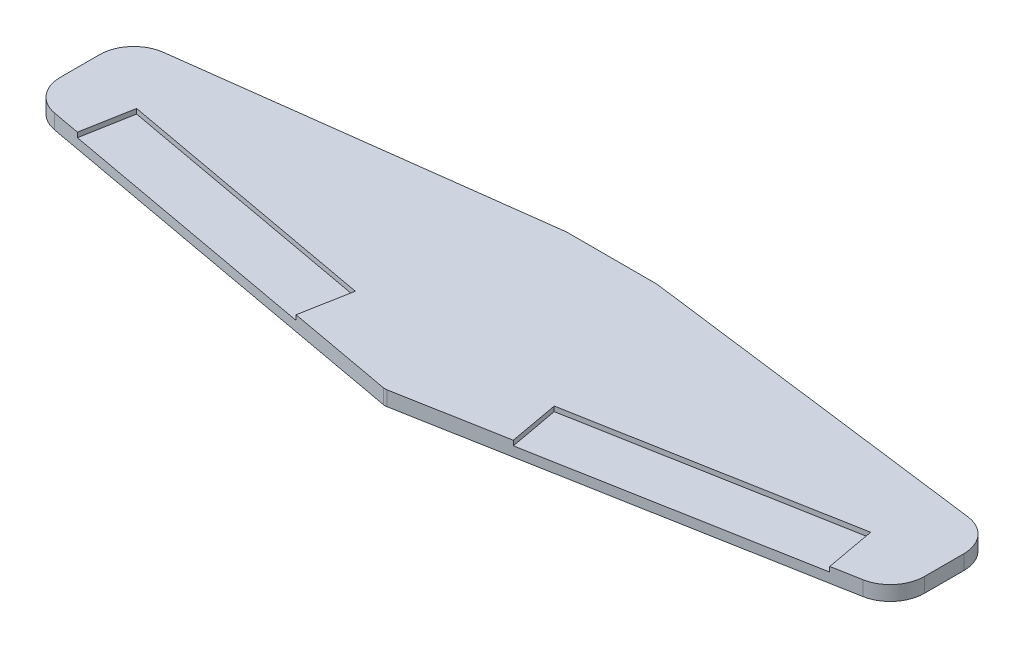
ISO-10303-21;
HEADER;
FILE_DESCRIPTION(('STEP AP214'),'2;1');
FILE_NAME('part.step','',(''),(''),'','','');
FILE_SCHEMA(('AUTOMOTIVE_DESIGN { 1 0 10303 214 1 1 1 1 }'));
ENDSEC;
DATA;
#1=APPLICATION_CONTEXT('core data for automotive mechanical design processes');
#2=APPLICATION_PROTOCOL_DEFINITION('international standard','automotive_design',2000,#1);
#3=PRODUCT_CONTEXT('',#1,'mechanical');
#4=PRODUCT('Part','Part','',(#3));
#5=PRODUCT_RELATED_PRODUCT_CATEGORY('part','',(#4));
#6=PRODUCT_DEFINITION_FORMATION('','',#4);
#7=PRODUCT_DEFINITION_CONTEXT('part definition',#1,'design');
#8=PRODUCT_DEFINITION('design','',#6,#7);
#9=PRODUCT_DEFINITION_SHAPE('','',#8);
#10=(LENGTH_UNIT() NAMED_UNIT(*) SI_UNIT(.MILLI.,.METRE.));
#11=(NAMED_UNIT(*) PLANE_ANGLE_UNIT() SI_UNIT($,.RADIAN.));
#12=(NAMED_UNIT(*) SI_UNIT($,.STERADIAN.) SOLID_ANGLE_UNIT());
#13=UNCERTAINTY_MEASURE_WITH_UNIT(LENGTH_MEASURE(1.E-05),#10,'distance_accuracy_value','');
#14=(GEOMETRIC_REPRESENTATION_CONTEXT(3) GLOBAL_UNCERTAINTY_ASSIGNED_CONTEXT((#13)) GLOBAL_UNIT_ASSIGNED_CONTEXT((#10,
#11,#12)) REPRESENTATION_CONTEXT('',''));
#15=CARTESIAN_POINT('',(0.,0.,0.));
#16=DIRECTION('',(0.,0.,1.));
#17=DIRECTION('',(1.,0.,0.));
#18=AXIS2_PLACEMENT_3D('',#15,#16,#17);
#19=CARTESIAN_POINT('',(-9.26124305778792,3.,-19.1353726476667));
#20=DIRECTION('',(0.127743051926493,0.,0.991807296144017));
#21=DIRECTION('',(0.991807296144017,0.,-0.127743051926493));
#22=AXIS2_PLACEMENT_3D('',#19,#20,#21);
#23=PLANE('',#22);
#24=DIRECTION('',(-0.991807296144017,0.,0.127743051926493));
#25=VECTOR('',#24,1.);
#26=CARTESIAN_POINT('',(-9.26124305778792,0.,-19.1353726476667));
#27=LINE('',#26,#25);
#28=CARTESIAN_POINT('',(-9.26124305778792,0.,-19.1353726476667));
#29=VERTEX_POINT('',#28);
#30=CARTESIAN_POINT('',(-82.3942013634854,0.,-9.71597502203537));
#31=VERTEX_POINT('',#30);
#32=EDGE_CURVE('E257',#29,#31,#27,.T.);
#33=ORIENTED_EDGE('',*,*,#32,.T.);
#34=DIRECTION('',(0.,-1.,0.));
#35=VECTOR('',#34,1.);
#36=CARTESIAN_POINT('',(-82.3942013634854,3.,-9.71597502203537));
#37=LINE('',#36,#35);
#38=CARTESIAN_POINT('',(-82.3942013634854,3.,-9.71597502203537));
#39=VERTEX_POINT('',#38);
#40=EDGE_CURVE('E307',#39,#31,#37,.T.);
#41=ORIENTED_EDGE('',*,*,#40,.F.);
#42=DIRECTION('',(-0.991807296144017,0.,0.127743051926493));
#43=VECTOR('',#42,1.);
#44=CARTESIAN_POINT('',(-9.26124305778792,3.,-19.1353726476667));
#45=LINE('',#44,#43);
#46=CARTESIAN_POINT('',(-9.26124305778792,3.,-19.1353726476667));
#47=VERTEX_POINT('',#46);
#48=EDGE_CURVE('E229',#47,#39,#45,.T.);
#49=ORIENTED_EDGE('',*,*,#48,.F.);
#50=DIRECTION('',(0.,-1.,0.));
#51=VECTOR('',#50,1.);
#52=CARTESIAN_POINT('',(-9.26124305778792,3.,-19.1353726476667));
#53=LINE('',#52,#51);
#54=EDGE_CURVE('E256',#47,#29,#53,.T.);
#55=ORIENTED_EDGE('',*,*,#54,.T.);
#56=EDGE_LOOP('',(#33,#41,#49,#55));
#57=FACE_BOUND('',#56,.T.);
#58=ADVANCED_FACE('F38',(#57),#23,.F.);
#59=CARTESIAN_POINT('',(-81.5,3.,-2.77332394902725));
#60=DIRECTION('',(0.,-1.,0.));
#61=DIRECTION('',(0.,0.,-1.));
#62=AXIS2_PLACEMENT_3D('',#59,#60,#61);
#63=CYLINDRICAL_SURFACE('',#62,7.);
#64=CARTESIAN_POINT('',(-81.5,0.,-2.77332394902725));
#65=DIRECTION('',(0.,1.,0.));
#66=DIRECTION('',(0.,0.,1.));
#67=AXIS2_PLACEMENT_3D('',#64,#65,#66);
#68=CIRCLE('',#67,7.);
#69=CARTESIAN_POINT('',(-88.5,0.,-2.7733239490272));
#70=VERTEX_POINT('',#69);
#71=EDGE_CURVE('E260',#31,#70,#68,.T.);
#72=ORIENTED_EDGE('',*,*,#71,.T.);
#73=DIRECTION('',(0.,-1.,0.));
#74=VECTOR('',#73,1.);
#75=CARTESIAN_POINT('',(-88.5,3.,-2.7733239490272));
#76=LINE('',#75,#74);
#77=CARTESIAN_POINT('',(-88.5,3.,-2.7733239490272));
#78=VERTEX_POINT('',#77);
#79=EDGE_CURVE('E304',#78,#70,#76,.T.);
#80=ORIENTED_EDGE('',*,*,#79,.F.);
#81=CARTESIAN_POINT('',(-81.5,3.,-2.77332394902725));
#82=DIRECTION('',(0.,1.,0.));
#83=DIRECTION('',(0.,0.,1.));
#84=AXIS2_PLACEMENT_3D('',#81,#82,#83);
#85=CIRCLE('',#84,7.);
#86=EDGE_CURVE('E232',#39,#78,#85,.T.);
#87=ORIENTED_EDGE('',*,*,#86,.F.);
#88=ORIENTED_EDGE('',*,*,#40,.T.);
#89=EDGE_LOOP('',(#72,#80,#87,#88));
#90=FACE_BOUND('',#89,.T.);
#91=ADVANCED_FACE('F371',(#90),#63,.T.);
#92=CARTESIAN_POINT('',(-88.5,3.,-2.7733239490272));
#93=DIRECTION('',(1.,0.,0.));
#94=DIRECTION('',(0.,0.,-1.));
#95=AXIS2_PLACEMENT_3D('',#92,#93,#94);
#96=PLANE('',#95);
#97=DIRECTION('',(0.,0.,1.));
#98=VECTOR('',#97,1.);
#99=CARTESIAN_POINT('',(-88.5,0.,-2.7733239490272));
#100=LINE('',#99,#98);
#101=CARTESIAN_POINT('',(-88.5,0.,5.30107192058601));
#102=VERTEX_POINT('',#101);
#103=EDGE_CURVE('E263',#70,#102,#100,.T.);
#104=ORIENTED_EDGE('',*,*,#103,.T.);
#105=DIRECTION('',(0.,-1.,0.));
#106=VECTOR('',#105,1.);
#107=CARTESIAN_POINT('',(-88.5,3.,5.30107192058601));
#108=LINE('',#107,#106);
#109=CARTESIAN_POINT('',(-88.5,3.,5.30107192058601));
#110=VERTEX_POINT('',#109);
#111=EDGE_CURVE('E301',#110,#102,#108,.T.);
#112=ORIENTED_EDGE('',*,*,#111,.F.);
#113=DIRECTION('',(0.,0.,1.));
#114=VECTOR('',#113,1.);
#115=CARTESIAN_POINT('',(-88.5,3.,-2.7733239490272));
#116=LINE('',#115,#114);
#117=EDGE_CURVE('E235',#78,#110,#116,.T.);
#118=ORIENTED_EDGE('',*,*,#117,.F.);
#119=ORIENTED_EDGE('',*,*,#79,.T.);
#120=EDGE_LOOP('',(#104,#112,#118,#119));
#121=FACE_BOUND('',#120,.T.);
#122=ADVANCED_FACE('F378',(#121),#96,.F.);
#123=CARTESIAN_POINT('',(-81.5,3.,5.30107192058606));
#124=DIRECTION('',(0.,-1.,0.));
#125=DIRECTION('',(0.,0.,-1.));
#126=AXIS2_PLACEMENT_3D('',#123,#124,#125);
#127=CYLINDRICAL_SURFACE('',#126,7.);
#128=CARTESIAN_POINT('',(-81.5,0.,5.30107192058606));
#129=DIRECTION('',(0.,1.,0.));
#130=DIRECTION('',(0.,0.,1.));
#131=AXIS2_PLACEMENT_3D('',#128,#129,#130);
#132=CIRCLE('',#131,7.);
#133=CARTESIAN_POINT('',(-82.758061306265,0.,12.1870926691519));
#134=VERTEX_POINT('',#133);
#135=EDGE_CURVE('E265',#102,#134,#132,.T.);
#136=ORIENTED_EDGE('',*,*,#135,.T.);
#137=DIRECTION('',(0.,-1.,0.));
#138=VECTOR('',#137,1.);
#139=CARTESIAN_POINT('',(-82.758061306265,3.,12.1870926691519));
#140=LINE('',#139,#138);
#141=CARTESIAN_POINT('',(-82.758061306265,3.,12.1870926691519));
#142=VERTEX_POINT('',#141);
#143=EDGE_CURVE('E298',#142,#134,#140,.T.);
#144=ORIENTED_EDGE('',*,*,#143,.F.);
#145=CARTESIAN_POINT('',(-81.5,3.,5.30107192058606));
#146=DIRECTION('',(0.,1.,0.));
#147=DIRECTION('',(0.,0.,1.));
#148=AXIS2_PLACEMENT_3D('',#145,#146,#147);
#149=CIRCLE('',#148,7.);
#150=EDGE_CURVE('E237',#110,#142,#149,.T.);
#151=ORIENTED_EDGE('',*,*,#150,.F.);
#152=ORIENTED_EDGE('',*,*,#111,.T.);
#153=EDGE_LOOP('',(#136,#144,#151,#152));
#154=FACE_BOUND('',#153,.T.);
#155=ADVANCED_FACE('F382',(#154),#127,.T.);
#156=CARTESIAN_POINT('',(-82.758061306265,3.,12.1870926691519));
#157=DIRECTION('',(0.179723043752157,0.,-0.983717249795113));
#158=DIRECTION('',(-0.983717249795113,0.,-0.179723043752157));
#159=AXIS2_PLACEMENT_3D('',#156,#157,#158);
#160=PLANE('',#159);
#161=DIRECTION('',(0.983717249795113,0.,0.179723043752157));
#162=VECTOR('',#161,1.);
#163=CARTESIAN_POINT('',(-22.2418353088571,2.,23.2432781075111));
#164=LINE('',#163,#162);
#165=CARTESIAN_POINT('',(-77.0318534493877,2.,13.2332586334163));
#166=VERTEX_POINT('',#165);
#167=CARTESIAN_POINT('',(-22.2418353088571,2.,23.2432781075111));
#168=VERTEX_POINT('',#167);
#169=EDGE_CURVE('E181',#166,#168,#164,.T.);
#170=ORIENTED_EDGE('',*,*,#169,.F.);
#171=DIRECTION('',(0.,1.,0.));
#172=VECTOR('',#171,1.);
#173=CARTESIAN_POINT('',(-77.0318534493877,2.,13.2332586334163));
#174=LINE('',#173,#172);
#175=CARTESIAN_POINT('',(-77.0318534493877,3.,13.2332586334163));
#176=VERTEX_POINT('',#175);
#177=EDGE_CURVE('E261',#166,#176,#174,.T.);
#178=ORIENTED_EDGE('',*,*,#177,.T.);
#179=DIRECTION('',(0.983717249795113,0.,0.179723043752157));
#180=VECTOR('',#179,1.);
#181=CARTESIAN_POINT('',(-82.758061306265,3.,12.1870926691519));
#182=LINE('',#181,#180);
#183=EDGE_CURVE('E239',#142,#176,#182,.T.);
#184=ORIENTED_EDGE('',*,*,#183,.F.);
#185=ORIENTED_EDGE('',*,*,#143,.T.);
#186=DIRECTION('',(0.983717249795113,0.,0.179723043752157));
#187=VECTOR('',#186,1.);
#188=CARTESIAN_POINT('',(-82.758061306265,0.,12.1870926691519));
#189=LINE('',#188,#187);
#190=CARTESIAN_POINT('',(-0.359446087504323,0.,27.241143953871));
#191=VERTEX_POINT('',#190);
#192=EDGE_CURVE('E267',#134,#191,#189,.T.);
#193=ORIENTED_EDGE('',*,*,#192,.T.);
#194=DIRECTION('',(0.,-1.,0.));
#195=VECTOR('',#194,1.);
#196=CARTESIAN_POINT('',(-0.359446087504323,3.,27.241143953871));
#197=LINE('',#196,#195);
#198=CARTESIAN_POINT('',(-0.359446087504323,3.,27.241143953871));
#199=VERTEX_POINT('',#198);
#200=EDGE_CURVE('E46',#191,#199,#197,.F.);
#201=ORIENTED_EDGE('',*,*,#200,.T.);
#202=CARTESIAN_POINT('',(-22.2418353088571,3.,23.2432781075111));
#203=VERTEX_POINT('',#202);
#204=EDGE_CURVE('E195',#203,#199,#182,.T.);
#205=ORIENTED_EDGE('',*,*,#204,.F.);
#206=DIRECTION('',(0.,1.,0.));
#207=VECTOR('',#206,1.);
#208=CARTESIAN_POINT('',(-22.2418353088571,2.,23.2432781075111));
#209=LINE('',#208,#207);
#210=EDGE_CURVE('E61',#168,#203,#209,.T.);
#211=ORIENTED_EDGE('',*,*,#210,.F.);
#212=EDGE_LOOP('',(#170,#178,#184,#185,#193,#201,#205,#211));
#213=FACE_BOUND('',#212,.T.);
#214=ADVANCED_FACE('F193',(#213),#160,.F.);
#215=CARTESIAN_POINT('',(82.758061306265,3.,12.1870926691519));
#216=DIRECTION('',(-0.179723043752157,0.,-0.983717249795113));
#217=DIRECTION('',(-0.983717249795113,0.,0.179723043752157));
#218=AXIS2_PLACEMENT_3D('',#215,#216,#217);
#219=PLANE('',#218);
#220=DIRECTION('',(0.983717249795113,0.,-0.179723043752157));
#221=VECTOR('',#220,1.);
#222=CARTESIAN_POINT('',(82.758061306265,3.,12.1870926691519));
#223=LINE('',#222,#221);
#224=CARTESIAN_POINT('',(77.0318534493877,3.,13.2332586334163));
#225=VERTEX_POINT('',#224);
#226=CARTESIAN_POINT('',(82.758061306265,3.,12.1870926691519));
#227=VERTEX_POINT('',#226);
#228=EDGE_CURVE('E242',#225,#227,#223,.T.);
#229=ORIENTED_EDGE('',*,*,#228,.F.);
#230=DIRECTION('',(0.,1.,0.));
#231=VECTOR('',#230,1.);
#232=CARTESIAN_POINT('',(77.0318534493877,2.,13.2332586334163));
#233=LINE('',#232,#231);
#234=CARTESIAN_POINT('',(77.0318534493877,2.,13.2332586334163));
#235=VERTEX_POINT('',#234);
#236=EDGE_CURVE('E208',#235,#225,#233,.T.);
#237=ORIENTED_EDGE('',*,*,#236,.F.);
#238=DIRECTION('',(0.983717249795113,0.,-0.179723043752157));
#239=VECTOR('',#238,1.);
#240=CARTESIAN_POINT('',(22.2418353088571,2.,23.2432781075111));
#241=LINE('',#240,#239);
#242=CARTESIAN_POINT('',(22.2418353088571,2.,23.2432781075111));
#243=VERTEX_POINT('',#242);
#244=EDGE_CURVE('E222',#243,#235,#241,.T.);
#245=ORIENTED_EDGE('',*,*,#244,.F.);
#246=DIRECTION('',(0.,1.,0.));
#247=VECTOR('',#246,1.);
#248=CARTESIAN_POINT('',(22.2418353088571,2.,23.2432781075111));
#249=LINE('',#248,#247);
#250=CARTESIAN_POINT('',(22.2418353088571,3.,23.2432781075111));
#251=VERTEX_POINT('',#250);
#252=EDGE_CURVE('E205',#243,#251,#249,.T.);
#253=ORIENTED_EDGE('',*,*,#252,.T.);
#254=CARTESIAN_POINT('',(0.359446087504323,3.,27.241143953871));
#255=VERTEX_POINT('',#254);
#256=EDGE_CURVE('E243',#255,#251,#223,.T.);
#257=ORIENTED_EDGE('',*,*,#256,.F.);
#258=DIRECTION('',(0.,-1.,0.));
#259=VECTOR('',#258,1.);
#260=CARTESIAN_POINT('',(0.359446087504323,3.,27.241143953871));
#261=LINE('',#260,#259);
#262=CARTESIAN_POINT('',(0.359446087504323,0.,27.241143953871));
#263=VERTEX_POINT('',#262);
#264=EDGE_CURVE('E310',#255,#263,#261,.T.);
#265=ORIENTED_EDGE('',*,*,#264,.T.);
#266=DIRECTION('',(0.983717249795113,0.,-0.179723043752157));
#267=VECTOR('',#266,1.);
#268=CARTESIAN_POINT('',(82.758061306265,0.,12.1870926691519));
#269=LINE('',#268,#267);
#270=CARTESIAN_POINT('',(82.758061306265,0.,12.1870926691519));
#271=VERTEX_POINT('',#270);
#272=EDGE_CURVE('E270',#263,#271,#269,.T.);
#273=ORIENTED_EDGE('',*,*,#272,.T.);
#274=DIRECTION('',(0.,-1.,0.));
#275=VECTOR('',#274,1.);
#276=CARTESIAN_POINT('',(82.758061306265,3.,12.1870926691519));
#277=LINE('',#276,#275);
#278=EDGE_CURVE('E295',#227,#271,#277,.T.);
#279=ORIENTED_EDGE('',*,*,#278,.F.);
#280=EDGE_LOOP('',(#229,#237,#245,#253,#257,#265,#273,#279));
#281=FACE_BOUND('',#280,.T.);
#282=ADVANCED_FACE('F326',(#281),#219,.F.);
#283=CARTESIAN_POINT('',(81.5,3.,5.30107192058606));
#284=DIRECTION('',(0.,-1.,0.));
#285=DIRECTION('',(0.,0.,-1.));
#286=AXIS2_PLACEMENT_3D('',#283,#284,#285);
#287=CYLINDRICAL_SURFACE('',#286,7.);
#288=CARTESIAN_POINT('',(81.5,0.,5.30107192058606));
#289=DIRECTION('',(0.,1.,0.));
#290=DIRECTION('',(0.,0.,-1.));
#291=AXIS2_PLACEMENT_3D('',#288,#289,#290);
#292=CIRCLE('',#291,7.);
#293=CARTESIAN_POINT('',(88.5,0.,5.30107192058602));
#294=VERTEX_POINT('',#293);
#295=EDGE_CURVE('E272',#271,#294,#292,.T.);
#296=ORIENTED_EDGE('',*,*,#295,.T.);
#297=DIRECTION('',(0.,-1.,0.));
#298=VECTOR('',#297,1.);
#299=CARTESIAN_POINT('',(88.5,3.,5.30107192058602));
#300=LINE('',#299,#298);
#301=CARTESIAN_POINT('',(88.5,3.,5.30107192058602));
#302=VERTEX_POINT('',#301);
#303=EDGE_CURVE('E292',#302,#294,#300,.T.);
#304=ORIENTED_EDGE('',*,*,#303,.F.);
#305=CARTESIAN_POINT('',(81.5,3.,5.30107192058606));
#306=DIRECTION('',(0.,1.,0.));
#307=DIRECTION('',(0.,0.,-1.));
#308=AXIS2_PLACEMENT_3D('',#305,#306,#307);
#309=CIRCLE('',#308,7.);
#310=EDGE_CURVE('E246',#227,#302,#309,.T.);
#311=ORIENTED_EDGE('',*,*,#310,.F.);
#312=ORIENTED_EDGE('',*,*,#278,.T.);
#313=EDGE_LOOP('',(#296,#304,#311,#312));
#314=FACE_BOUND('',#313,.T.);
#315=ADVANCED_FACE('F345',(#314),#287,.T.);
#316=CARTESIAN_POINT('',(88.5,3.,-2.7733239490272));
#317=DIRECTION('',(-1.,0.,0.));
#318=DIRECTION('',(0.,0.,1.));
#319=AXIS2_PLACEMENT_3D('',#316,#317,#318);
#320=PLANE('',#319);
#321=DIRECTION('',(0.,0.,-1.));
#322=VECTOR('',#321,1.);
#323=CARTESIAN_POINT('',(88.5,0.,-2.7733239490272));
#324=LINE('',#323,#322);
#325=CARTESIAN_POINT('',(88.5,0.,-2.7733239490272));
#326=VERTEX_POINT('',#325);
#327=EDGE_CURVE('E274',#294,#326,#324,.T.);
#328=ORIENTED_EDGE('',*,*,#327,.T.);
#329=DIRECTION('',(0.,-1.,0.));
#330=VECTOR('',#329,1.);
#331=CARTESIAN_POINT('',(88.5,3.,-2.7733239490272));
#332=LINE('',#331,#330);
#333=CARTESIAN_POINT('',(88.5,3.,-2.7733239490272));
#334=VERTEX_POINT('',#333);
#335=EDGE_CURVE('E289',#334,#326,#332,.T.);
#336=ORIENTED_EDGE('',*,*,#335,.F.);
#337=DIRECTION('',(0.,0.,-1.));
#338=VECTOR('',#337,1.);
#339=CARTESIAN_POINT('',(88.5,3.,-2.7733239490272));
#340=LINE('',#339,#338);
#341=EDGE_CURVE('E248',#302,#334,#340,.T.);
#342=ORIENTED_EDGE('',*,*,#341,.F.);
#343=ORIENTED_EDGE('',*,*,#303,.T.);
#344=EDGE_LOOP('',(#328,#336,#342,#343));
#345=FACE_BOUND('',#344,.T.);
#346=ADVANCED_FACE('F351',(#345),#320,.F.);
#347=CARTESIAN_POINT('',(81.5,3.,-2.77332394902725));
#348=DIRECTION('',(0.,-1.,0.));
#349=DIRECTION('',(0.,0.,-1.));
#350=AXIS2_PLACEMENT_3D('',#347,#348,#349);
#351=CYLINDRICAL_SURFACE('',#350,7.);
#352=CARTESIAN_POINT('',(81.5,0.,-2.77332394902725));
#353=DIRECTION('',(0.,1.,0.));
#354=DIRECTION('',(0.,0.,-1.));
#355=AXIS2_PLACEMENT_3D('',#352,#353,#354);
#356=CIRCLE('',#355,7.);
#357=CARTESIAN_POINT('',(82.3942013634854,0.,-9.71597502203537));
#358=VERTEX_POINT('',#357);
#359=EDGE_CURVE('E276',#326,#358,#356,.T.);
#360=ORIENTED_EDGE('',*,*,#359,.T.);
#361=DIRECTION('',(0.,-1.,0.));
#362=VECTOR('',#361,1.);
#363=CARTESIAN_POINT('',(82.3942013634854,3.,-9.71597502203537));
#364=LINE('',#363,#362);
#365=CARTESIAN_POINT('',(82.3942013634854,3.,-9.71597502203537));
#366=VERTEX_POINT('',#365);
#367=EDGE_CURVE('E286',#366,#358,#364,.T.);
#368=ORIENTED_EDGE('',*,*,#367,.F.);
#369=CARTESIAN_POINT('',(81.5,3.,-2.77332394902725));
#370=DIRECTION('',(0.,1.,0.));
#371=DIRECTION('',(0.,0.,-1.));
#372=AXIS2_PLACEMENT_3D('',#369,#370,#371);
#373=CIRCLE('',#372,7.);
#374=EDGE_CURVE('E250',#334,#366,#373,.T.);
#375=ORIENTED_EDGE('',*,*,#374,.F.);
#376=ORIENTED_EDGE('',*,*,#335,.T.);
#377=EDGE_LOOP('',(#360,#368,#375,#376));
#378=FACE_BOUND('',#377,.T.);
#379=ADVANCED_FACE('F355',(#378),#351,.T.);
#380=CARTESIAN_POINT('',(9.26124305778792,3.,-19.1353726476667));
#381=DIRECTION('',(-0.127743051926493,0.,0.991807296144017));
#382=DIRECTION('',(0.991807296144017,0.,0.127743051926493));
#383=AXIS2_PLACEMENT_3D('',#380,#381,#382);
#384=PLANE('',#383);
#385=DIRECTION('',(-0.991807296144017,0.,-0.127743051926493));
#386=VECTOR('',#385,1.);
#387=CARTESIAN_POINT('',(9.26124305778792,0.,-19.1353726476667));
#388=LINE('',#387,#386);
#389=CARTESIAN_POINT('',(9.26124305778792,0.,-19.1353726476667));
#390=VERTEX_POINT('',#389);
#391=EDGE_CURVE('E278',#358,#390,#388,.T.);
#392=ORIENTED_EDGE('',*,*,#391,.T.);
#393=DIRECTION('',(0.,-1.,0.));
#394=VECTOR('',#393,1.);
#395=CARTESIAN_POINT('',(9.26124305778792,3.,-19.1353726476667));
#396=LINE('',#395,#394);
#397=CARTESIAN_POINT('',(9.26124305778792,3.,-19.1353726476667));
#398=VERTEX_POINT('',#397);
#399=EDGE_CURVE('E283',#398,#390,#396,.T.);
#400=ORIENTED_EDGE('',*,*,#399,.F.);
#401=DIRECTION('',(-0.991807296144017,0.,-0.127743051926493));
#402=VECTOR('',#401,1.);
#403=CARTESIAN_POINT('',(9.26124305778792,3.,-19.1353726476667));
#404=LINE('',#403,#402);
#405=EDGE_CURVE('E252',#366,#398,#404,.T.);
#406=ORIENTED_EDGE('',*,*,#405,.F.);
#407=ORIENTED_EDGE('',*,*,#367,.T.);
#408=EDGE_LOOP('',(#392,#400,#406,#407));
#409=FACE_BOUND('',#408,.T.);
#410=ADVANCED_FACE('F360',(#409),#384,.F.);
#411=CARTESIAN_POINT('',(9.26124305778792,3.,-19.1353726476667));
#412=DIRECTION('',(0.,0.,1.));
#413=DIRECTION('',(1.,0.,0.));
#414=AXIS2_PLACEMENT_3D('',#411,#412,#413);
#415=PLANE('',#414);
#416=DIRECTION('',(-1.,0.,0.));
#417=VECTOR('',#416,1.);
#418=CARTESIAN_POINT('',(9.26124305778792,0.,-19.1353726476667));
#419=LINE('',#418,#417);
#420=EDGE_CURVE('E233',#390,#29,#419,.T.);
#421=ORIENTED_EDGE('',*,*,#420,.T.);
#422=ORIENTED_EDGE('',*,*,#54,.F.);
#423=DIRECTION('',(-1.,0.,0.));
#424=VECTOR('',#423,1.);
#425=CARTESIAN_POINT('',(9.26124305778792,3.,-19.1353726476667));
#426=LINE('',#425,#424);
#427=EDGE_CURVE('E254',#398,#47,#426,.T.);
#428=ORIENTED_EDGE('',*,*,#427,.F.);
#429=ORIENTED_EDGE('',*,*,#399,.T.);
#430=EDGE_LOOP('',(#421,#422,#428,#429));
#431=FACE_BOUND('',#430,.T.);
#432=ADVANCED_FACE('F366',(#431),#415,.F.);
#433=CARTESIAN_POINT('',(-81.5,3.,-2.77332394902725));
#434=DIRECTION('',(0.,1.,0.));
#435=DIRECTION('',(0.,0.,1.));
#436=AXIS2_PLACEMENT_3D('',#433,#434,#435);
#437=PLANE('',#436);
#438=DIRECTION('',(-0.179723043752156,0.,0.983717249795113));
#439=VECTOR('',#438,1.);
#440=CARTESIAN_POINT('',(-77.0318534493877,3.,13.2332586334163));
#441=LINE('',#440,#439);
#442=CARTESIAN_POINT('',(-75.1589751677171,3.,2.98202632629677));
#443=VERTEX_POINT('',#442);
#444=EDGE_CURVE('E190',#443,#176,#441,.T.);
#445=ORIENTED_EDGE('',*,*,#444,.F.);
#446=DIRECTION('',(-0.983717249795113,0.,-0.179723043752156));
#447=VECTOR('',#446,1.);
#448=CARTESIAN_POINT('',(-75.1589751677171,3.,2.98202632629677));
#449=LINE('',#448,#447);
#450=CARTESIAN_POINT('',(-20.3689570271866,3.,12.9920458003915));
#451=VERTEX_POINT('',#450);
#452=EDGE_CURVE('E386',#451,#443,#449,.T.);
#453=ORIENTED_EDGE('',*,*,#452,.F.);
#454=DIRECTION('',(0.179723043752156,0.,-0.983717249795113));
#455=VECTOR('',#454,1.);
#456=CARTESIAN_POINT('',(-20.3689570271866,3.,12.9920458003915));
#457=LINE('',#456,#455);
#458=EDGE_CURVE('E219',#203,#451,#457,.T.);
#459=ORIENTED_EDGE('',*,*,#458,.F.);
#460=ORIENTED_EDGE('',*,*,#204,.T.);
#461=CARTESIAN_POINT('',(0.,3.,25.2737094542807));
#462=DIRECTION('',(0.,1.,0.));
#463=DIRECTION('',(0.,0.,1.));
#464=AXIS2_PLACEMENT_3D('',#461,#462,#463);
#465=CIRCLE('',#464,2.);
#466=EDGE_CURVE('E11',#199,#255,#465,.T.);
#467=ORIENTED_EDGE('',*,*,#466,.T.);
#468=ORIENTED_EDGE('',*,*,#256,.T.);
#469=DIRECTION('',(0.179723043752156,0.,0.983717249795113));
#470=VECTOR('',#469,1.);
#471=CARTESIAN_POINT('',(20.3689570271866,3.,12.9920458003915));
#472=LINE('',#471,#470);
#473=CARTESIAN_POINT('',(20.3689570271866,3.,12.9920458003915));
#474=VERTEX_POINT('',#473);
#475=EDGE_CURVE('E215',#474,#251,#472,.T.);
#476=ORIENTED_EDGE('',*,*,#475,.F.);
#477=DIRECTION('',(-0.983717249795113,0.,0.179723043752156));
#478=VECTOR('',#477,1.);
#479=CARTESIAN_POINT('',(75.1589751677171,3.,2.98202632629677));
#480=LINE('',#479,#478);
#481=CARTESIAN_POINT('',(75.1589751677171,3.,2.98202632629677));
#482=VERTEX_POINT('',#481);
#483=EDGE_CURVE('E53',#482,#474,#480,.T.);
#484=ORIENTED_EDGE('',*,*,#483,.F.);
#485=DIRECTION('',(-0.179723043752156,0.,-0.983717249795113));
#486=VECTOR('',#485,1.);
#487=CARTESIAN_POINT('',(77.0318534493877,3.,13.2332586334163));
#488=LINE('',#487,#486);
#489=EDGE_CURVE('E212',#225,#482,#488,.T.);
#490=ORIENTED_EDGE('',*,*,#489,.F.);
#491=ORIENTED_EDGE('',*,*,#228,.T.);
#492=ORIENTED_EDGE('',*,*,#310,.T.);
#493=ORIENTED_EDGE('',*,*,#341,.T.);
#494=ORIENTED_EDGE('',*,*,#374,.T.);
#495=ORIENTED_EDGE('',*,*,#405,.T.);
#496=ORIENTED_EDGE('',*,*,#427,.T.);
#497=ORIENTED_EDGE('',*,*,#48,.T.);
#498=ORIENTED_EDGE('',*,*,#86,.T.);
#499=ORIENTED_EDGE('',*,*,#117,.T.);
#500=ORIENTED_EDGE('',*,*,#150,.T.);
#501=ORIENTED_EDGE('',*,*,#183,.T.);
#502=EDGE_LOOP('',(#445,#453,#459,#460,#467,#468,#476,#484,#490,#491,#492,#493,#494,#495,#496,
#497,#498,#499,#500,#501));
#503=FACE_BOUND('',#502,.T.);
#504=ADVANCED_FACE('F322',(#503),#437,.T.);
#505=CARTESIAN_POINT('',(-81.5,0.,-2.77332394902725));
#506=DIRECTION('',(0.,1.,0.));
#507=DIRECTION('',(0.,0.,1.));
#508=AXIS2_PLACEMENT_3D('',#505,#506,#507);
#509=PLANE('',#508);
#510=ORIENTED_EDGE('',*,*,#272,.F.);
#511=CARTESIAN_POINT('',(0.,0.,25.2737094542807));
#512=DIRECTION('',(0.,1.,0.));
#513=DIRECTION('',(0.,0.,1.));
#514=AXIS2_PLACEMENT_3D('',#511,#512,#513);
#515=CIRCLE('',#514,2.);
#516=EDGE_CURVE('E313',#263,#191,#515,.F.);
#517=ORIENTED_EDGE('',*,*,#516,.T.);
#518=ORIENTED_EDGE('',*,*,#192,.F.);
#519=ORIENTED_EDGE('',*,*,#135,.F.);
#520=ORIENTED_EDGE('',*,*,#103,.F.);
#521=ORIENTED_EDGE('',*,*,#71,.F.);
#522=ORIENTED_EDGE('',*,*,#32,.F.);
#523=ORIENTED_EDGE('',*,*,#420,.F.);
#524=ORIENTED_EDGE('',*,*,#391,.F.);
#525=ORIENTED_EDGE('',*,*,#359,.F.);
#526=ORIENTED_EDGE('',*,*,#327,.F.);
#527=ORIENTED_EDGE('',*,*,#295,.F.);
#528=EDGE_LOOP('',(#510,#517,#518,#519,#520,#521,#522,#523,#524,#525,#526,#527));
#529=FACE_BOUND('',#528,.T.);
#530=ADVANCED_FACE('F428',(#529),#509,.F.);
#531=CARTESIAN_POINT('',(0.,3.,25.2737094542807));
#532=DIRECTION('',(0.,-1.,0.));
#533=DIRECTION('',(0.,0.,-1.));
#534=AXIS2_PLACEMENT_3D('',#531,#532,#533);
#535=CYLINDRICAL_SURFACE('',#534,2.);
#536=ORIENTED_EDGE('',*,*,#466,.F.);
#537=ORIENTED_EDGE('',*,*,#200,.F.);
#538=ORIENTED_EDGE('',*,*,#516,.F.);
#539=ORIENTED_EDGE('',*,*,#264,.F.);
#540=EDGE_LOOP('',(#536,#537,#538,#539));
#541=FACE_BOUND('',#540,.T.);
#542=ADVANCED_FACE('F40',(#541),#535,.T.);
#543=CARTESIAN_POINT('',(75.1589751677171,2.,2.98202632629677));
#544=DIRECTION('',(-0.179723043752156,0.,-0.983717249795113));
#545=DIRECTION('',(-0.983717249795113,0.,0.179723043752156));
#546=AXIS2_PLACEMENT_3D('',#543,#544,#545);
#547=PLANE('',#546);
#548=ORIENTED_EDGE('',*,*,#483,.T.);
#549=DIRECTION('',(0.,1.,0.));
#550=VECTOR('',#549,1.);
#551=CARTESIAN_POINT('',(20.3689570271866,2.,12.9920458003915));
#552=LINE('',#551,#550);
#553=CARTESIAN_POINT('',(20.3689570271866,2.,12.9920458003915));
#554=VERTEX_POINT('',#553);
#555=EDGE_CURVE('E202',#554,#474,#552,.T.);
#556=ORIENTED_EDGE('',*,*,#555,.F.);
#557=DIRECTION('',(-0.983717249795113,0.,0.179723043752156));
#558=VECTOR('',#557,1.);
#559=CARTESIAN_POINT('',(75.1589751677171,2.,2.98202632629677));
#560=LINE('',#559,#558);
#561=CARTESIAN_POINT('',(75.1589751677171,2.,2.98202632629677));
#562=VERTEX_POINT('',#561);
#563=EDGE_CURVE('E216',#562,#554,#560,.T.);
#564=ORIENTED_EDGE('',*,*,#563,.F.);
#565=DIRECTION('',(0.,1.,0.));
#566=VECTOR('',#565,1.);
#567=CARTESIAN_POINT('',(75.1589751677171,2.,2.98202632629677));
#568=LINE('',#567,#566);
#569=EDGE_CURVE('E210',#562,#482,#568,.T.);
#570=ORIENTED_EDGE('',*,*,#569,.T.);
#571=EDGE_LOOP('',(#548,#556,#564,#570));
#572=FACE_BOUND('',#571,.T.);
#573=ADVANCED_FACE('F337',(#572),#547,.F.);
#574=CARTESIAN_POINT('',(77.0318534493877,2.,13.2332586334163));
#575=DIRECTION('',(0.983717249795113,0.,-0.179723043752156));
#576=DIRECTION('',(-0.179723043752156,0.,-0.983717249795113));
#577=AXIS2_PLACEMENT_3D('',#574,#575,#576);
#578=PLANE('',#577);
#579=ORIENTED_EDGE('',*,*,#489,.T.);
#580=ORIENTED_EDGE('',*,*,#569,.F.);
#581=DIRECTION('',(-0.179723043752156,0.,-0.983717249795113));
#582=VECTOR('',#581,1.);
#583=CARTESIAN_POINT('',(77.0318534493877,2.,13.2332586334163));
#584=LINE('',#583,#582);
#585=EDGE_CURVE('E204',#235,#562,#584,.T.);
#586=ORIENTED_EDGE('',*,*,#585,.F.);
#587=ORIENTED_EDGE('',*,*,#236,.T.);
#588=EDGE_LOOP('',(#579,#580,#586,#587));
#589=FACE_BOUND('',#588,.T.);
#590=ADVANCED_FACE('F436',(#589),#578,.F.);
#591=CARTESIAN_POINT('',(20.3689570271866,2.,12.9920458003915));
#592=DIRECTION('',(-0.983717249795113,0.,0.179723043752156));
#593=DIRECTION('',(0.179723043752156,0.,0.983717249795113));
#594=AXIS2_PLACEMENT_3D('',#591,#592,#593);
#595=PLANE('',#594);
#596=ORIENTED_EDGE('',*,*,#475,.T.);
#597=ORIENTED_EDGE('',*,*,#252,.F.);
#598=DIRECTION('',(0.179723043752156,0.,0.983717249795113));
#599=VECTOR('',#598,1.);
#600=CARTESIAN_POINT('',(20.3689570271866,2.,12.9920458003915));
#601=LINE('',#600,#599);
#602=EDGE_CURVE('E224',#554,#243,#601,.T.);
#603=ORIENTED_EDGE('',*,*,#602,.F.);
#604=ORIENTED_EDGE('',*,*,#555,.T.);
#605=EDGE_LOOP('',(#596,#597,#603,#604));
#606=FACE_BOUND('',#605,.T.);
#607=ADVANCED_FACE('F332',(#606),#595,.F.);
#608=CARTESIAN_POINT('',(0.,2.,0.));
#609=DIRECTION('',(0.,1.,0.));
#610=DIRECTION('',(0.,0.,1.));
#611=AXIS2_PLACEMENT_3D('',#608,#609,#610);
#612=PLANE('',#611);
#613=ORIENTED_EDGE('',*,*,#563,.T.);
#614=ORIENTED_EDGE('',*,*,#602,.T.);
#615=ORIENTED_EDGE('',*,*,#244,.T.);
#616=ORIENTED_EDGE('',*,*,#585,.T.);
#617=EDGE_LOOP('',(#613,#614,#615,#616));
#618=FACE_BOUND('',#617,.T.);
#619=ADVANCED_FACE('F334',(#618),#612,.T.);
#620=CARTESIAN_POINT('',(-77.0318534493877,2.,13.2332586334163));
#621=DIRECTION('',(-0.983717249795113,0.,-0.179723043752156));
#622=DIRECTION('',(-0.179723043752156,0.,0.983717249795113));
#623=AXIS2_PLACEMENT_3D('',#620,#621,#622);
#624=PLANE('',#623);
#625=ORIENTED_EDGE('',*,*,#444,.T.);
#626=ORIENTED_EDGE('',*,*,#177,.F.);
#627=DIRECTION('',(-0.179723043752156,0.,0.983717249795113));
#628=VECTOR('',#627,1.);
#629=CARTESIAN_POINT('',(-77.0318534493877,2.,13.2332586334163));
#630=LINE('',#629,#628);
#631=CARTESIAN_POINT('',(-75.1589751677171,2.,2.98202632629677));
#632=VERTEX_POINT('',#631);
#633=EDGE_CURVE('E187',#632,#166,#630,.T.);
#634=ORIENTED_EDGE('',*,*,#633,.F.);
#635=DIRECTION('',(0.,1.,0.));
#636=VECTOR('',#635,1.);
#637=CARTESIAN_POINT('',(-75.1589751677171,2.,2.98202632629677));
#638=LINE('',#637,#636);
#639=EDGE_CURVE('E197',#632,#443,#638,.T.);
#640=ORIENTED_EDGE('',*,*,#639,.T.);
#641=EDGE_LOOP('',(#625,#626,#634,#640));
#642=FACE_BOUND('',#641,.T.);
#643=ADVANCED_FACE('F392',(#642),#624,.F.);
#644=CARTESIAN_POINT('',(-75.1589751677171,2.,2.98202632629677));
#645=DIRECTION('',(0.179723043752156,0.,-0.983717249795113));
#646=DIRECTION('',(-0.983717249795113,0.,-0.179723043752156));
#647=AXIS2_PLACEMENT_3D('',#644,#645,#646);
#648=PLANE('',#647);
#649=ORIENTED_EDGE('',*,*,#452,.T.);
#650=ORIENTED_EDGE('',*,*,#639,.F.);
#651=DIRECTION('',(-0.983717249795113,0.,-0.179723043752156));
#652=VECTOR('',#651,1.);
#653=CARTESIAN_POINT('',(-75.1589751677171,2.,2.98202632629677));
#654=LINE('',#653,#652);
#655=CARTESIAN_POINT('',(-20.3689570271866,2.,12.9920458003915));
#656=VERTEX_POINT('',#655);
#657=EDGE_CURVE('E180',#656,#632,#654,.T.);
#658=ORIENTED_EDGE('',*,*,#657,.F.);
#659=DIRECTION('',(0.,1.,0.));
#660=VECTOR('',#659,1.);
#661=CARTESIAN_POINT('',(-20.3689570271866,2.,12.9920458003915));
#662=LINE('',#661,#660);
#663=EDGE_CURVE('E176',#656,#451,#662,.T.);
#664=ORIENTED_EDGE('',*,*,#663,.T.);
#665=EDGE_LOOP('',(#649,#650,#658,#664));
#666=FACE_BOUND('',#665,.T.);
#667=ADVANCED_FACE('F394',(#666),#648,.F.);
#668=CARTESIAN_POINT('',(-20.3689570271866,2.,12.9920458003915));
#669=DIRECTION('',(0.983717249795113,0.,0.179723043752156));
#670=DIRECTION('',(0.179723043752156,0.,-0.983717249795113));
#671=AXIS2_PLACEMENT_3D('',#668,#669,#670);
#672=PLANE('',#671);
#673=ORIENTED_EDGE('',*,*,#458,.T.);
#674=ORIENTED_EDGE('',*,*,#663,.F.);
#675=DIRECTION('',(0.179723043752156,0.,-0.983717249795113));
#676=VECTOR('',#675,1.);
#677=CARTESIAN_POINT('',(-20.3689570271866,2.,12.9920458003915));
#678=LINE('',#677,#676);
#679=EDGE_CURVE('E173',#168,#656,#678,.T.);
#680=ORIENTED_EDGE('',*,*,#679,.F.);
#681=ORIENTED_EDGE('',*,*,#210,.T.);
#682=EDGE_LOOP('',(#673,#674,#680,#681));
#683=FACE_BOUND('',#682,.T.);
#684=ADVANCED_FACE('F175',(#683),#672,.F.);
#685=CARTESIAN_POINT('',(0.,2.,0.));
#686=DIRECTION('',(0.,-1.,0.));
#687=DIRECTION('',(0.,0.,-1.));
#688=AXIS2_PLACEMENT_3D('',#685,#686,#687);
#689=PLANE('',#688);
#690=ORIENTED_EDGE('',*,*,#169,.T.);
#691=ORIENTED_EDGE('',*,*,#679,.T.);
#692=ORIENTED_EDGE('',*,*,#657,.T.);
#693=ORIENTED_EDGE('',*,*,#633,.T.);
#694=EDGE_LOOP('',(#690,#691,#692,#693));
#695=FACE_BOUND('',#694,.T.);
#696=ADVANCED_FACE('F185',(#695),#689,.F.);
#697=CLOSED_SHELL('',(#58,#91,#122,#155,#214,#282,#315,#346,#379,#410,#432,#504,#530,#542,#573,
#590,#607,#619,#643,#667,#684,#696));
#698=MANIFOLD_SOLID_BREP('B2',#697);
#699=ADVANCED_BREP_SHAPE_REPRESENTATION('',(#18,#698),#14);
#700=SHAPE_DEFINITION_REPRESENTATION(#9,#699);
ENDSEC;
END-ISO-10303-21;
